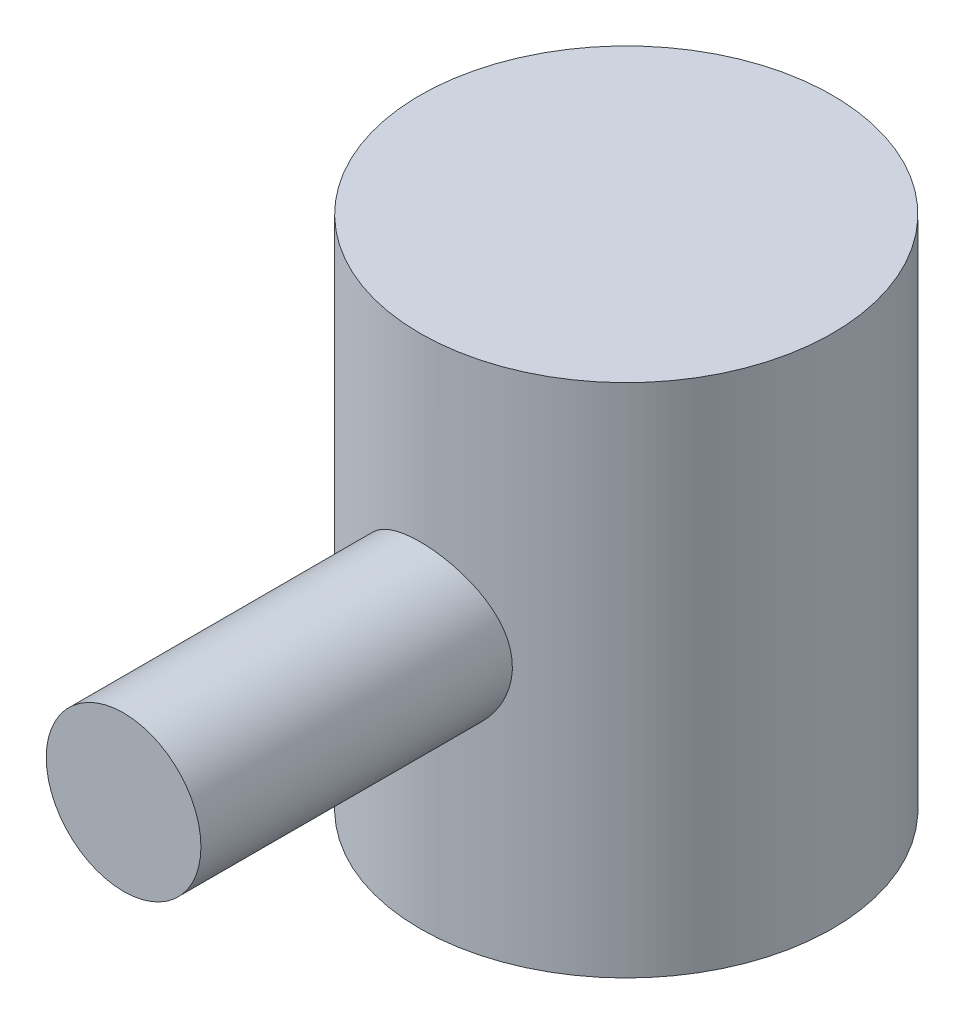
ISO-10303-21;
HEADER;
FILE_DESCRIPTION(('STEP AP214'),'2;1');
FILE_NAME('part.step','',(''),(''),'','','');
FILE_SCHEMA(('AUTOMOTIVE_DESIGN { 1 0 10303 214 1 1 1 1 }'));
ENDSEC;
DATA;
#1=APPLICATION_CONTEXT('core data for automotive mechanical design processes');
#2=APPLICATION_PROTOCOL_DEFINITION('international standard','automotive_design',2000,#1);
#3=PRODUCT_CONTEXT('',#1,'mechanical');
#4=PRODUCT('Part','Part','',(#3));
#5=PRODUCT_RELATED_PRODUCT_CATEGORY('part','',(#4));
#6=PRODUCT_DEFINITION_FORMATION('','',#4);
#7=PRODUCT_DEFINITION_CONTEXT('part definition',#1,'design');
#8=PRODUCT_DEFINITION('design','',#6,#7);
#9=PRODUCT_DEFINITION_SHAPE('','',#8);
#10=(LENGTH_UNIT() NAMED_UNIT(*) SI_UNIT(.MILLI.,.METRE.));
#11=(NAMED_UNIT(*) PLANE_ANGLE_UNIT() SI_UNIT($,.RADIAN.));
#12=(NAMED_UNIT(*) SI_UNIT($,.STERADIAN.) SOLID_ANGLE_UNIT());
#13=UNCERTAINTY_MEASURE_WITH_UNIT(LENGTH_MEASURE(1.E-05),#10,'distance_accuracy_value','');
#14=(GEOMETRIC_REPRESENTATION_CONTEXT(3) GLOBAL_UNCERTAINTY_ASSIGNED_CONTEXT((#13)) GLOBAL_UNIT_ASSIGNED_CONTEXT((#10,
#11,#12)) REPRESENTATION_CONTEXT('',''));
#15=CARTESIAN_POINT('',(0.,0.,0.));
#16=DIRECTION('',(0.,0.,1.));
#17=DIRECTION('',(1.,0.,0.));
#18=AXIS2_PLACEMENT_3D('',#15,#16,#17);
#19=CARTESIAN_POINT('',(0.,200.,0.));
#20=DIRECTION('',(0.,-1.,0.));
#21=DIRECTION('',(0.,0.,-1.));
#22=AXIS2_PLACEMENT_3D('',#19,#20,#21);
#23=CYLINDRICAL_SURFACE('',#22,80.);
#24=CARTESIAN_POINT('',(0.,200.,0.));
#25=DIRECTION('',(0.,1.,0.));
#26=DIRECTION('',(0.,0.,1.));
#27=AXIS2_PLACEMENT_3D('',#24,#25,#26);
#28=CIRCLE('',#27,80.);
#29=CARTESIAN_POINT('',(0.,200.,80.));
#30=VERTEX_POINT('',#29);
#31=EDGE_CURVE('E53',#30,#30,#28,.T.);
#32=ORIENTED_EDGE('',*,*,#31,.F.);
#33=EDGE_LOOP('',(#32));
#34=FACE_BOUND('',#33,.T.);
#35=CARTESIAN_POINT('',(0.,0.,0.));
#36=DIRECTION('',(0.,1.,0.));
#37=DIRECTION('',(0.,0.,1.));
#38=AXIS2_PLACEMENT_3D('',#35,#36,#37);
#39=CIRCLE('',#38,80.);
#40=CARTESIAN_POINT('',(0.,0.,80.));
#41=VERTEX_POINT('',#40);
#42=EDGE_CURVE('E57',#41,#41,#39,.T.);
#43=ORIENTED_EDGE('',*,*,#42,.T.);
#44=EDGE_LOOP('',(#43));
#45=FACE_BOUND('',#44,.T.);
#46=CARTESIAN_POINT('',(-30.,100.,74.1619848709567));
#47=CARTESIAN_POINT('',(-30.0000038840874,99.1899633753693,74.1619813150315));
#48=CARTESIAN_POINT('',(-29.9671654492927,98.379979695195,74.1752919536678));
#49=CARTESIAN_POINT('',(-29.8361844121891,96.7662233001576,74.2280750747366));
#50=CARTESIAN_POINT('',(-29.7380472814491,95.9624500706109,74.2675453651743));
#51=CARTESIAN_POINT('',(-29.4775079481706,94.367078439031,74.3713392473516));
#52=CARTESIAN_POINT('',(-29.3151086783181,93.5754794831215,74.4356617049274));
#53=CARTESIAN_POINT('',(-28.9276772146703,92.0100177009272,74.587081161617));
#54=CARTESIAN_POINT('',(-28.702643176835,91.2361553975561,74.6741788312548));
#55=CARTESIAN_POINT('',(-28.1926033779519,89.713098577453,74.8682262594156));
#56=CARTESIAN_POINT('',(-27.9077467350797,88.9638479839236,74.9751265797049));
#57=CARTESIAN_POINT('',(-27.4371560228592,87.8607068375744,75.1480557921831));
#58=CARTESIAN_POINT('',(-27.2730664929796,87.4964330329863,75.2077982812681));
#59=CARTESIAN_POINT('',(-26.930708111913,86.7751620692726,75.3310698511593));
#60=CARTESIAN_POINT('',(-26.7524362047254,86.4181664993843,75.394599747328));
#61=CARTESIAN_POINT('',(-26.1968550125168,85.3589466218915,75.5902047053186));
#62=CARTESIAN_POINT('',(-25.798752845461,84.6684249676358,75.7273052202092));
#63=CARTESIAN_POINT('',(-24.9499099138264,83.3226195956148,76.011197567279));
#64=CARTESIAN_POINT('',(-24.4991665029232,82.6673376518032,76.1579898865127));
#65=CARTESIAN_POINT('',(-23.7749827667205,81.6991108184196,76.3859812376736));
#66=CARTESIAN_POINT('',(-23.519583704019,81.3720313083115,76.4650517776329));
#67=CARTESIAN_POINT('',(-22.9956448378751,80.7289777592268,76.6242473705825));
#68=CARTESIAN_POINT('',(-22.7271081751157,80.4130010967321,76.7043721682252));
#69=CARTESIAN_POINT('',(-21.9022412671287,79.4822260345369,76.9455645385473));
#70=CARTESIAN_POINT('',(-21.3266224213684,78.8845402219241,77.1074601677657));
#71=CARTESIAN_POINT('',(-20.1275040308966,77.7385603938768,77.4291225568508));
#72=CARTESIAN_POINT('',(-19.5039947667526,77.1902764539537,77.5888888768088));
#73=CARTESIAN_POINT('',(-18.2126805518312,76.1465431688975,77.9021153739527));
#74=CARTESIAN_POINT('',(-17.5448750205071,75.6510945164454,78.0555754684464));
#75=CARTESIAN_POINT('',(-16.145345116369,74.7004425673236,78.3572425332974));
#76=CARTESIAN_POINT('',(-15.4122173864119,74.2471887804116,78.5050917083886));
#77=CARTESIAN_POINT('',(-13.9073974833762,73.4043615397199,78.7855951865583));
#78=CARTESIAN_POINT('',(-13.1357041814233,73.0147899514443,78.9182490444717));
#79=CARTESIAN_POINT('',(-11.5592146819459,72.3028455934004,79.1645171965958));
#80=CARTESIAN_POINT('',(-10.7544274390865,71.9804547870401,79.2781365995371));
#81=CARTESIAN_POINT('',(-9.11741882654955,71.4058567091374,79.4830353727669));
#82=CARTESIAN_POINT('',(-8.28519897876965,71.1536455514949,79.5743159800011));
#83=CARTESIAN_POINT('',(-6.63612741710205,70.7313355427383,79.7284000825877));
#84=CARTESIAN_POINT('',(-5.8201607900759,70.558164541017,79.7922619307553));
#85=CARTESIAN_POINT('',(-4.17510830511653,70.2802381536461,79.8952284863778));
#86=CARTESIAN_POINT('',(-3.34602279212899,70.175480972187,79.9343338436704));
#87=CARTESIAN_POINT('',(-1.68141829226227,70.0355163918524,79.9866617645333));
#88=CARTESIAN_POINT('',(-0.845901157925241,70.0002896666227,79.9998915203531));
#89=CARTESIAN_POINT('',(0.825148438643143,69.9997139223102,80.0001071338015));
#90=CARTESIAN_POINT('',(1.66068089964704,70.0343627902639,79.9870937849936));
#91=CARTESIAN_POINT('',(3.28385366971863,70.1697069156728,79.9364919043527));
#92=CARTESIAN_POINT('',(4.07181571067018,70.2670446580868,79.9001529660858));
#93=CARTESIAN_POINT('',(5.63620294659247,70.5235441494971,79.8050578873888));
#94=CARTESIAN_POINT('',(6.41262859223439,70.6827034767955,79.7463026250608));
#95=CARTESIAN_POINT('',(7.94871796807476,71.0613807290888,79.6078680929979));
#96=CARTESIAN_POINT('',(8.70838109898602,71.2809008083143,79.5281880764785));
#97=CARTESIAN_POINT('',(10.2060314617401,71.7783844307601,79.3498941044443));
#98=CARTESIAN_POINT('',(10.9440181283922,72.0563494963325,79.2512796557385));
#99=CARTESIAN_POINT('',(12.4043307068888,72.6729101668695,79.0359741609555));
#100=CARTESIAN_POINT('',(13.1262740312677,73.012326961487,78.9190415963637));
#101=CARTESIAN_POINT('',(14.5389522258162,73.7463802654698,78.6710445643668));
#102=CARTESIAN_POINT('',(15.2296869905761,74.1410169613266,78.5399800492347));
#103=CARTESIAN_POINT('',(16.5762936953635,74.9828629757308,78.2668424834421));
#104=CARTESIAN_POINT('',(17.2321565006463,75.4300859717434,78.1247665720556));
#105=CARTESIAN_POINT('',(18.5053259928998,76.3741429997247,77.8330236951649));
#106=CARTESIAN_POINT('',(19.1226312100287,76.8709789210983,77.6833564406671));
#107=CARTESIAN_POINT('',(20.3504860088631,77.9419085561052,77.3710672402832));
#108=CARTESIAN_POINT('',(20.9585239884605,78.5188224786202,77.2081998646244));
#109=CARTESIAN_POINT('',(21.8326230830494,79.4205938249326,76.9638111969321));
#110=CARTESIAN_POINT('',(22.117679457471,79.7272709470813,76.8823287058333));
#111=CARTESIAN_POINT('',(22.6748484154947,80.3524403922157,76.7198504673318));
#112=CARTESIAN_POINT('',(22.946957686366,80.6709357023713,76.6388548490859));
#113=CARTESIAN_POINT('',(23.7431487087253,81.6433997422229,76.3974507058803));
#114=CARTESIAN_POINT('',(24.2471372904495,82.3143915847586,76.2386125669468));
#115=CARTESIAN_POINT('',(25.1979530439594,83.6976246294225,75.9296595593022));
#116=CARTESIAN_POINT('',(25.6447815998666,84.4098648321208,75.7795444794116));
#117=CARTESIAN_POINT('',(26.2743511272376,85.5140248792368,75.562617751259));
#118=CARTESIAN_POINT('',(26.4794422253014,85.8923946952711,75.4909453127839));
#119=CARTESIAN_POINT('',(26.8733854140792,86.6580919596815,75.3516076452558));
#120=CARTESIAN_POINT('',(27.0622414346814,87.0454172113215,75.2839414476874));
#121=CARTESIAN_POINT('',(27.6039426843327,88.2201160189144,75.087749554755));
#122=CARTESIAN_POINT('',(27.9319609072715,89.0202823955389,74.9660166885932));
#123=CARTESIAN_POINT('',(28.5182943100632,90.6482472726004,74.7449337653239));
#124=CARTESIAN_POINT('',(28.7766412814261,91.4760329757028,74.6455735028592));
#125=CARTESIAN_POINT('',(29.2211726500898,93.1534244443674,74.4726801726384));
#126=CARTESIAN_POINT('',(29.4073620034407,94.0030287070753,74.3991453311303));
#127=CARTESIAN_POINT('',(29.6972219760778,95.6698010946816,74.2839008962999));
#128=CARTESIAN_POINT('',(29.8048792644761,96.4861719444138,74.2406590102472));
#129=CARTESIAN_POINT('',(29.9527232603186,98.1259768609085,74.1811350111738));
#130=CARTESIAN_POINT('',(29.9929124569989,98.9494106659565,74.164851903509));
#131=CARTESIAN_POINT('',(30.0053706404916,100.596689156421,74.1598123481183));
#132=CARTESIAN_POINT('',(29.9776545636068,101.420533711637,74.1710498470168));
#133=CARTESIAN_POINT('',(29.8546443500781,103.062323268544,74.2206480569113));
#134=CARTESIAN_POINT('',(29.7593515253546,103.880268384453,74.2590082413533));
#135=CARTESIAN_POINT('',(29.5083598954127,105.465313522276,74.3590876992372));
#136=CARTESIAN_POINT('',(29.355749881502,106.232981452974,74.4196091152393));
#137=CARTESIAN_POINT('',(28.9916304436008,107.752125239437,74.5622126256043));
#138=CARTESIAN_POINT('',(28.7801232979201,108.503601720322,74.6442938859637));
#139=CARTESIAN_POINT('',(28.3000181212182,109.985785927421,74.8276347680368));
#140=CARTESIAN_POINT('',(28.0314116378109,110.716490560613,74.9288972288919));
#141=CARTESIAN_POINT('',(27.4392857782214,112.152740475651,75.1477556128597));
#142=CARTESIAN_POINT('',(27.1157642028772,112.858284748541,75.2653521900637));
#143=CARTESIAN_POINT('',(26.4029767607341,114.266338655834,75.5184153451299));
#144=CARTESIAN_POINT('',(26.0117020929725,114.967744553893,75.6543863160623));
#145=CARTESIAN_POINT('',(25.3845295983129,115.993322486637,75.8661605348932));
#146=CARTESIAN_POINT('',(25.1687493519402,116.330777383683,75.9380589716245));
#147=CARTESIAN_POINT('',(24.7240353125063,116.996539316401,76.0840119208496));
#148=CARTESIAN_POINT('',(24.4950986962565,117.324844366019,76.1580668944143));
#149=CARTESIAN_POINT('',(23.7890754420354,118.295353015726,76.3827456261888));
#150=CARTESIAN_POINT('',(23.2927785544922,118.923144959581,76.5358821189336));
#151=CARTESIAN_POINT('',(22.2520037584301,120.136716843435,76.8449276458297));
#152=CARTESIAN_POINT('',(21.7075242793945,120.722495412876,77.0008367702226));
#153=CARTESIAN_POINT('',(20.8389974755016,121.585107993199,77.2388115439198));
#154=CARTESIAN_POINT('',(20.5310680299175,121.878206928541,77.3212816049991));
#155=CARTESIAN_POINT('',(19.9029847754489,122.451099108575,77.4853312179856));
#156=CARTESIAN_POINT('',(19.5828337749312,122.730895377273,77.5669109690007));
#157=CARTESIAN_POINT('',(18.6045627837893,123.549806004575,77.8095198583768));
#158=CARTESIAN_POINT('',(17.9285883785766,124.068478361927,77.9684287185431));
#159=CARTESIAN_POINT('',(16.5334672268307,125.047371661123,78.2761447023558));
#160=CARTESIAN_POINT('',(15.8143189225522,125.507590492053,78.4249514610978));
#161=CARTESIAN_POINT('',(14.3372645530408,126.36612167434,78.7083741382932));
#162=CARTESIAN_POINT('',(13.5793593781726,126.764435447,78.8429903825292));
#163=CARTESIAN_POINT('',(12.0324257958311,127.494540480247,79.0938212471081));
#164=CARTESIAN_POINT('',(11.2435118331294,127.826553074308,79.2100968114381));
#165=CARTESIAN_POINT('',(9.63764568880595,128.422689236533,79.4214803116076));
#166=CARTESIAN_POINT('',(8.8206933631671,128.686812455928,79.5165881387018));
#167=CARTESIAN_POINT('',(7.16517545133711,129.144424763845,79.6828214029021));
#168=CARTESIAN_POINT('',(6.32661837748665,129.337941229437,79.7539561345205));
#169=CARTESIAN_POINT('',(4.63423598528322,129.652394179438,79.8701638212721));
#170=CARTESIAN_POINT('',(3.7804115479914,129.773334838277,79.9152382753407));
#171=CARTESIAN_POINT('',(2.11460787322621,129.936390181937,79.9761349466295));
#172=CARTESIAN_POINT('',(1.30309246269495,129.98269086688,79.9935099259179));
#173=CARTESIAN_POINT('',(-0.321153855820917,130.009273566516,80.0034769100236));
#174=CARTESIAN_POINT('',(-1.13388471224586,129.989558306438,79.9960699378735));
#175=CARTESIAN_POINT('',(-2.75436948739967,129.884321468347,79.956677707566));
#176=CARTESIAN_POINT('',(-3.56212396274668,129.798807389895,79.9246952504521));
#177=CARTESIAN_POINT('',(-5.16677837481636,129.562849123223,79.8370218909896));
#178=CARTESIAN_POINT('',(-5.96367831911836,129.412404980345,79.7813310051966));
#179=CARTESIAN_POINT('',(-7.52159902106508,129.052521977321,79.6493676188279));
#180=CARTESIAN_POINT('',(-8.28302058387486,128.844616589622,79.5736320227658));
#181=CARTESIAN_POINT('',(-9.78514273605927,128.370254503857,79.4029117635525));
#182=CARTESIAN_POINT('',(-10.5258438053319,128.103799163108,79.3079275466306));
#183=CARTESIAN_POINT('',(-11.9821013023027,127.514474875898,79.1010128805991));
#184=CARTESIAN_POINT('',(-12.6976543747243,127.191598435727,78.9890801806984));
#185=CARTESIAN_POINT('',(-14.0993821299447,126.491907733094,78.750955430367));
#186=CARTESIAN_POINT('',(-14.7855557251797,126.115091476139,78.6247628526953));
#187=CARTESIAN_POINT('',(-16.1530294064604,125.293127835377,78.3555058433326));
#188=CARTESIAN_POINT('',(-16.8329126317565,124.84577421423,78.2119552207435));
#189=CARTESIAN_POINT('',(-17.8227114166364,124.135368824021,77.9901627049176));
#190=CARTESIAN_POINT('',(-18.1476573425685,123.891989816016,77.9151497249198));
#191=CARTESIAN_POINT('',(-18.7872405392419,123.392397865978,77.7634079458638));
#192=CARTESIAN_POINT('',(-19.1018754917911,123.13618207018,77.686678767393));
#193=CARTESIAN_POINT('',(-20.0296335000448,122.348863855087,77.4546324744367));
#194=CARTESIAN_POINT('',(-20.6266087236363,121.799091313811,77.2974568248401));
#195=CARTESIAN_POINT('',(-21.773957442464,120.653140533235,76.9821334936169));
#196=CARTESIAN_POINT('',(-22.3243298686599,120.056961229994,76.8239857897813));
#197=CARTESIAN_POINT('',(-23.1264440008604,119.114130227849,76.5849266893153));
#198=CARTESIAN_POINT('',(-23.3962166623864,118.782957910127,76.502893136198));
#199=CARTESIAN_POINT('',(-23.9214766144821,118.109262176987,76.3402810750387));
#200=CARTESIAN_POINT('',(-24.1769672138613,117.766741420262,76.2597022329288));
#201=CARTESIAN_POINT('',(-24.9215012995149,116.722717930729,76.0209869729293));
#202=CARTESIAN_POINT('',(-25.388650179481,116.004703317197,75.8658588318634));
#203=CARTESIAN_POINT('',(-26.2608618354866,114.529341758389,75.5683774183061));
#204=CARTESIAN_POINT('',(-26.6659159769281,113.771989362557,75.426025923613));
#205=CARTESIAN_POINT('',(-27.4106221334664,112.222779841871,75.1585948914068));
#206=CARTESIAN_POINT('',(-27.7502730667253,111.430922146529,75.0335156396045));
#207=CARTESIAN_POINT('',(-28.3744626758004,109.782645872246,74.7997725908408));
#208=CARTESIAN_POINT('',(-28.6559199434932,108.924919585039,74.692072873935));
#209=CARTESIAN_POINT('',(-29.1409662082978,107.184703351361,74.5041735642375));
#210=CARTESIAN_POINT('',(-29.3445517020789,106.302212292678,74.4239752087062));
#211=CARTESIAN_POINT('',(-29.6712443975046,104.520717579331,74.2943350648757));
#212=CARTESIAN_POINT('',(-29.7943966533443,103.621723459418,74.2448760588673));
#213=CARTESIAN_POINT('',(-29.9587674792034,101.81513006051,74.1787048721424));
#214=CARTESIAN_POINT('',(-29.9999956484278,100.907531802202,74.1619888548693));
#215=CARTESIAN_POINT('',(-30.,100.,74.1619848709567));
#216=B_SPLINE_CURVE_WITH_KNOTS('',3,(#46,#47,#48,#49,#50,#51,#52,#53,#54,#55,#56,#57,#58,#59,
#60,#61,#62,#63,#64,#65,#66,#67,#68,#69,#70,#71,#72,#73,#74,#75,#76,#77,#78,#79,#80,#81,#82,#83,
#84,#85,#86,#87,#88,#89,#90,#91,#92,#93,#94,#95,#96,#97,#98,#99,#100,#101,#102,#103,#104,#105,
#106,#107,#108,#109,#110,#111,#112,#113,#114,#115,#116,#117,#118,#119,#120,#121,#122,#123,#124,
#125,#126,#127,#128,#129,#130,#131,#132,#133,#134,#135,#136,#137,#138,#139,#140,#141,#142,#143,
#144,#145,#146,#147,#148,#149,#150,#151,#152,#153,#154,#155,#156,#157,#158,#159,#160,#161,#162,
#163,#164,#165,#166,#167,#168,#169,#170,#171,#172,#173,#174,#175,#176,#177,#178,#179,#180,#181,
#182,#183,#184,#185,#186,#187,#188,#189,#190,#191,#192,#193,#194,#195,#196,#197,#198,#199,#200,
#201,#202,#203,#204,#205,#206,#207,#208,#209,#210,#211,#212,#213,#214,#215),.UNSPECIFIED.,.T.,
.F.,(4,2,2,2,2,2,2,2,2,2,2,2,2,2,2,2,2,2,2,2,2,2,2,2,2,2,2,2,2,2,2,2,2,2,2,2,2,2,2,2,2,2,2,2,2,
2,2,2,2,2,2,2,2,2,2,2,2,2,2,2,2,2,2,2,2,2,2,2,2,2,2,2,2,2,2,2,2,2,2,2,2,2,2,2,4),(0.,
2.42924779325857,4.85829205836042,7.28722548366475,9.71623042714242,12.1392510341014,
13.3508700738223,14.5627509025155,16.9863016105379,19.4099742052004,20.677002408754,
21.9437291818914,24.4770217185191,27.0108297561472,29.5446710084163,32.1649515121441,
34.7853087605248,37.404961590485,40.0244693319484,42.5310059834877,45.0374768377492,
47.5432509071599,50.0489492057654,52.4304956910842,54.8119488949894,57.1934871022263,
59.5750873505228,61.9912429564655,64.4074067225765,66.8242003181672,69.241085987439,
71.799476462806,73.0788286718428,74.3585064831362,76.9176710751435,79.4767736856209,
80.7853252132237,82.0935590936247,84.7097831547265,87.3248113855973,89.9396599748863,
92.4102127486766,94.8806743693949,97.3505926412999,99.8204629640576,102.172854346698,
104.525154744734,106.877803595383,109.230546683817,111.671423640178,112.891993187223,
114.112825638039,116.554508910369,118.996271798962,120.295069715192,121.593570958822,
124.190416983037,126.787356759696,129.384236903413,131.972297362506,134.560371116975,
137.147440302333,139.73436066982,142.170403231787,144.606345231854,147.042009631386,
149.477672330095,151.853742120785,154.229756834751,156.60608736523,158.982505786316,
161.458800786777,162.697086853047,163.935649436492,166.412778283013,168.889963938005,
170.194469882308,171.498672340716,174.106874584537,176.715439184173,179.324046928515,
182.047399794872,184.770875166258,187.492823687922,190.214453254755),.UNSPECIFIED.);
#217=CARTESIAN_POINT('',(-30.,100.,74.1619848709567));
#218=VERTEX_POINT('',#217);
#219=EDGE_CURVE('E10',#218,#218,#216,.T.);
#220=ORIENTED_EDGE('',*,*,#219,.F.);
#221=EDGE_LOOP('',(#220));
#222=FACE_BOUND('',#221,.T.);
#223=ADVANCED_FACE('F42',(#34,#45,#222),#23,.T.);
#224=CARTESIAN_POINT('',(0.,200.,0.));
#225=DIRECTION('',(0.,1.,0.));
#226=DIRECTION('',(0.,0.,1.));
#227=AXIS2_PLACEMENT_3D('',#224,#225,#226);
#228=PLANE('',#227);
#229=ORIENTED_EDGE('',*,*,#31,.T.);
#230=EDGE_LOOP('',(#229));
#231=FACE_BOUND('',#230,.T.);
#232=ADVANCED_FACE('F104',(#231),#228,.T.);
#233=CARTESIAN_POINT('',(0.,0.,0.));
#234=DIRECTION('',(0.,1.,0.));
#235=DIRECTION('',(0.,0.,1.));
#236=AXIS2_PLACEMENT_3D('',#233,#234,#235);
#237=PLANE('',#236);
#238=CARTESIAN_POINT('',(-37.5234521575985,0.,-0.0234521575986192));
#239=DIRECTION('',(0.,-1.,0.));
#240=DIRECTION('',(1.,0.,0.));
#241=AXIS2_PLACEMENT_3D('',#238,#239,#240);
#242=CIRCLE('',#241,2.);
#243=CARTESIAN_POINT('',(-35.5234521575985,0.,-0.0234521575986123));
#244=VERTEX_POINT('',#243);
#245=EDGE_CURVE('E85',#244,#244,#242,.T.);
#246=ORIENTED_EDGE('',*,*,#245,.F.);
#247=EDGE_LOOP('',(#246));
#248=FACE_BOUND('',#247,.T.);
#249=CARTESIAN_POINT('',(0.,0.,-37.546904315197));
#250=DIRECTION('',(0.,-1.,0.));
#251=DIRECTION('',(0.,0.,1.));
#252=AXIS2_PLACEMENT_3D('',#249,#250,#251);
#253=CIRCLE('',#252,2.);
#254=CARTESIAN_POINT('',(0.,0.,-35.546904315197));
#255=VERTEX_POINT('',#254);
#256=EDGE_CURVE('E79',#255,#255,#253,.T.);
#257=ORIENTED_EDGE('',*,*,#256,.F.);
#258=EDGE_LOOP('',(#257));
#259=FACE_BOUND('',#258,.T.);
#260=CARTESIAN_POINT('',(37.5234521575985,0.,-0.0234521575980952));
#261=DIRECTION('',(0.,-1.,0.));
#262=DIRECTION('',(-1.,0.,0.));
#263=AXIS2_PLACEMENT_3D('',#260,#261,#262);
#264=CIRCLE('',#263,2.);
#265=CARTESIAN_POINT('',(35.5234521575985,0.,-0.0234521575981161));
#266=VERTEX_POINT('',#265);
#267=EDGE_CURVE('E73',#266,#266,#264,.T.);
#268=ORIENTED_EDGE('',*,*,#267,.F.);
#269=EDGE_LOOP('',(#268));
#270=FACE_BOUND('',#269,.T.);
#271=CARTESIAN_POINT('',(0.,0.,37.5));
#272=DIRECTION('',(0.,-1.,0.));
#273=DIRECTION('',(0.,0.,-1.));
#274=AXIS2_PLACEMENT_3D('',#271,#272,#273);
#275=CIRCLE('',#274,2.);
#276=CARTESIAN_POINT('',(0.,0.,35.5));
#277=VERTEX_POINT('',#276);
#278=EDGE_CURVE('E67',#277,#277,#275,.T.);
#279=ORIENTED_EDGE('',*,*,#278,.F.);
#280=EDGE_LOOP('',(#279));
#281=FACE_BOUND('',#280,.T.);
#282=ORIENTED_EDGE('',*,*,#42,.F.);
#283=EDGE_LOOP('',(#282));
#284=FACE_BOUND('',#283,.T.);
#285=ADVANCED_FACE('F100',(#248,#259,#270,#281,#284),#237,.F.);
#286=CARTESIAN_POINT('',(0.,100.,195.));
#287=DIRECTION('',(0.,0.,-1.));
#288=DIRECTION('',(-1.,0.,0.));
#289=AXIS2_PLACEMENT_3D('',#286,#287,#288);
#290=CYLINDRICAL_SURFACE('',#289,30.);
#291=CARTESIAN_POINT('',(0.,100.,195.));
#292=DIRECTION('',(0.,0.,1.));
#293=DIRECTION('',(1.,0.,0.));
#294=AXIS2_PLACEMENT_3D('',#291,#292,#293);
#295=CIRCLE('',#294,30.);
#296=CARTESIAN_POINT('',(30.,100.,195.));
#297=VERTEX_POINT('',#296);
#298=EDGE_CURVE('E62',#297,#297,#295,.T.);
#299=ORIENTED_EDGE('',*,*,#298,.F.);
#300=EDGE_LOOP('',(#299));
#301=FACE_BOUND('',#300,.T.);
#302=ORIENTED_EDGE('',*,*,#219,.T.);
#303=EDGE_LOOP('',(#302));
#304=FACE_BOUND('',#303,.T.);
#305=ADVANCED_FACE('F103',(#301,#304),#290,.T.);
#306=CARTESIAN_POINT('',(0.,100.,195.));
#307=DIRECTION('',(0.,0.,1.));
#308=DIRECTION('',(1.,0.,0.));
#309=AXIS2_PLACEMENT_3D('',#306,#307,#308);
#310=PLANE('',#309);
#311=ORIENTED_EDGE('',*,*,#298,.T.);
#312=EDGE_LOOP('',(#311));
#313=FACE_BOUND('',#312,.T.);
#314=ADVANCED_FACE('F126',(#313),#310,.T.);
#315=CARTESIAN_POINT('',(0.,2.,37.5));
#316=DIRECTION('',(0.,-1.,0.));
#317=DIRECTION('',(0.,0.,-1.));
#318=AXIS2_PLACEMENT_3D('',#315,#316,#317);
#319=CYLINDRICAL_SURFACE('',#318,2.);
#320=CARTESIAN_POINT('',(0.,2.,37.5));
#321=DIRECTION('',(0.,-1.,0.));
#322=DIRECTION('',(0.,0.,-1.));
#323=AXIS2_PLACEMENT_3D('',#320,#321,#322);
#324=CIRCLE('',#323,2.);
#325=CARTESIAN_POINT('',(0.,2.,35.5));
#326=VERTEX_POINT('',#325);
#327=EDGE_CURVE('E66',#326,#326,#324,.T.);
#328=ORIENTED_EDGE('',*,*,#327,.F.);
#329=EDGE_LOOP('',(#328));
#330=FACE_BOUND('',#329,.T.);
#331=ORIENTED_EDGE('',*,*,#278,.T.);
#332=EDGE_LOOP('',(#331));
#333=FACE_BOUND('',#332,.T.);
#334=ADVANCED_FACE('F130',(#330,#333),#319,.F.);
#335=CARTESIAN_POINT('',(0.,2.,37.5));
#336=DIRECTION('',(0.,-1.,0.));
#337=DIRECTION('',(0.,0.,-1.));
#338=AXIS2_PLACEMENT_3D('',#335,#336,#337);
#339=PLANE('',#338);
#340=ORIENTED_EDGE('',*,*,#327,.T.);
#341=EDGE_LOOP('',(#340));
#342=FACE_BOUND('',#341,.T.);
#343=ADVANCED_FACE('F134',(#342),#339,.T.);
#344=CARTESIAN_POINT('',(37.5234521575985,2.,-0.0234521575980952));
#345=DIRECTION('',(0.,-1.,0.));
#346=DIRECTION('',(0.,0.,-1.));
#347=AXIS2_PLACEMENT_3D('',#344,#345,#346);
#348=CYLINDRICAL_SURFACE('',#347,2.);
#349=CARTESIAN_POINT('',(37.5234521575985,2.,-0.0234521575980952));
#350=DIRECTION('',(0.,-1.,0.));
#351=DIRECTION('',(-1.,0.,0.));
#352=AXIS2_PLACEMENT_3D('',#349,#350,#351);
#353=CIRCLE('',#352,2.);
#354=CARTESIAN_POINT('',(35.5234521575985,2.,-0.0234521575981161));
#355=VERTEX_POINT('',#354);
#356=EDGE_CURVE('E76',#355,#355,#353,.T.);
#357=ORIENTED_EDGE('',*,*,#356,.F.);
#358=EDGE_LOOP('',(#357));
#359=FACE_BOUND('',#358,.T.);
#360=ORIENTED_EDGE('',*,*,#267,.T.);
#361=EDGE_LOOP('',(#360));
#362=FACE_BOUND('',#361,.T.);
#363=ADVANCED_FACE('F138',(#359,#362),#348,.F.);
#364=CARTESIAN_POINT('',(37.5234521575985,2.,-0.0234521575980952));
#365=DIRECTION('',(0.,-1.,0.));
#366=DIRECTION('',(-1.,0.,0.));
#367=AXIS2_PLACEMENT_3D('',#364,#365,#366);
#368=PLANE('',#367);
#369=ORIENTED_EDGE('',*,*,#356,.T.);
#370=EDGE_LOOP('',(#369));
#371=FACE_BOUND('',#370,.T.);
#372=ADVANCED_FACE('F142',(#371),#368,.T.);
#373=CARTESIAN_POINT('',(0.,2.,-37.546904315197));
#374=DIRECTION('',(0.,-1.,0.));
#375=DIRECTION('',(0.,0.,-1.));
#376=AXIS2_PLACEMENT_3D('',#373,#374,#375);
#377=CYLINDRICAL_SURFACE('',#376,2.);
#378=CARTESIAN_POINT('',(0.,2.,-37.546904315197));
#379=DIRECTION('',(0.,-1.,0.));
#380=DIRECTION('',(0.,0.,1.));
#381=AXIS2_PLACEMENT_3D('',#378,#379,#380);
#382=CIRCLE('',#381,2.);
#383=CARTESIAN_POINT('',(0.,2.,-35.546904315197));
#384=VERTEX_POINT('',#383);
#385=EDGE_CURVE('E82',#384,#384,#382,.T.);
#386=ORIENTED_EDGE('',*,*,#385,.F.);
#387=EDGE_LOOP('',(#386));
#388=FACE_BOUND('',#387,.T.);
#389=ORIENTED_EDGE('',*,*,#256,.T.);
#390=EDGE_LOOP('',(#389));
#391=FACE_BOUND('',#390,.T.);
#392=ADVANCED_FACE('F146',(#388,#391),#377,.F.);
#393=CARTESIAN_POINT('',(0.,2.,-37.546904315197));
#394=DIRECTION('',(0.,-1.,0.));
#395=DIRECTION('',(0.,0.,1.));
#396=AXIS2_PLACEMENT_3D('',#393,#394,#395);
#397=PLANE('',#396);
#398=ORIENTED_EDGE('',*,*,#385,.T.);
#399=EDGE_LOOP('',(#398));
#400=FACE_BOUND('',#399,.T.);
#401=ADVANCED_FACE('F96',(#400),#397,.T.);
#402=CARTESIAN_POINT('',(-37.5234521575985,2.,-0.0234521575986192));
#403=DIRECTION('',(0.,-1.,0.));
#404=DIRECTION('',(0.,0.,-1.));
#405=AXIS2_PLACEMENT_3D('',#402,#403,#404);
#406=CYLINDRICAL_SURFACE('',#405,2.);
#407=CARTESIAN_POINT('',(-37.5234521575985,2.,-0.0234521575986192));
#408=DIRECTION('',(0.,-1.,0.));
#409=DIRECTION('',(1.,0.,0.));
#410=AXIS2_PLACEMENT_3D('',#407,#408,#409);
#411=CIRCLE('',#410,2.);
#412=CARTESIAN_POINT('',(-35.5234521575985,2.,-0.0234521575986123));
#413=VERTEX_POINT('',#412);
#414=EDGE_CURVE('E70',#413,#413,#411,.T.);
#415=ORIENTED_EDGE('',*,*,#414,.F.);
#416=EDGE_LOOP('',(#415));
#417=FACE_BOUND('',#416,.T.);
#418=ORIENTED_EDGE('',*,*,#245,.T.);
#419=EDGE_LOOP('',(#418));
#420=FACE_BOUND('',#419,.T.);
#421=ADVANCED_FACE('F93',(#417,#420),#406,.F.);
#422=CARTESIAN_POINT('',(-37.5234521575985,2.,-0.0234521575986192));
#423=DIRECTION('',(0.,-1.,0.));
#424=DIRECTION('',(1.,0.,0.));
#425=AXIS2_PLACEMENT_3D('',#422,#423,#424);
#426=PLANE('',#425);
#427=ORIENTED_EDGE('',*,*,#414,.T.);
#428=EDGE_LOOP('',(#427));
#429=FACE_BOUND('',#428,.T.);
#430=ADVANCED_FACE('F91',(#429),#426,.T.);
#431=CLOSED_SHELL('',(#223,#232,#285,#305,#314,#334,#343,#363,#372,#392,#401,#421,#430));
#432=MANIFOLD_SOLID_BREP('B2',#431);
#433=ADVANCED_BREP_SHAPE_REPRESENTATION('',(#18,#432),#14);
#434=SHAPE_DEFINITION_REPRESENTATION(#9,#433);
ENDSEC;
END-ISO-10303-21;
